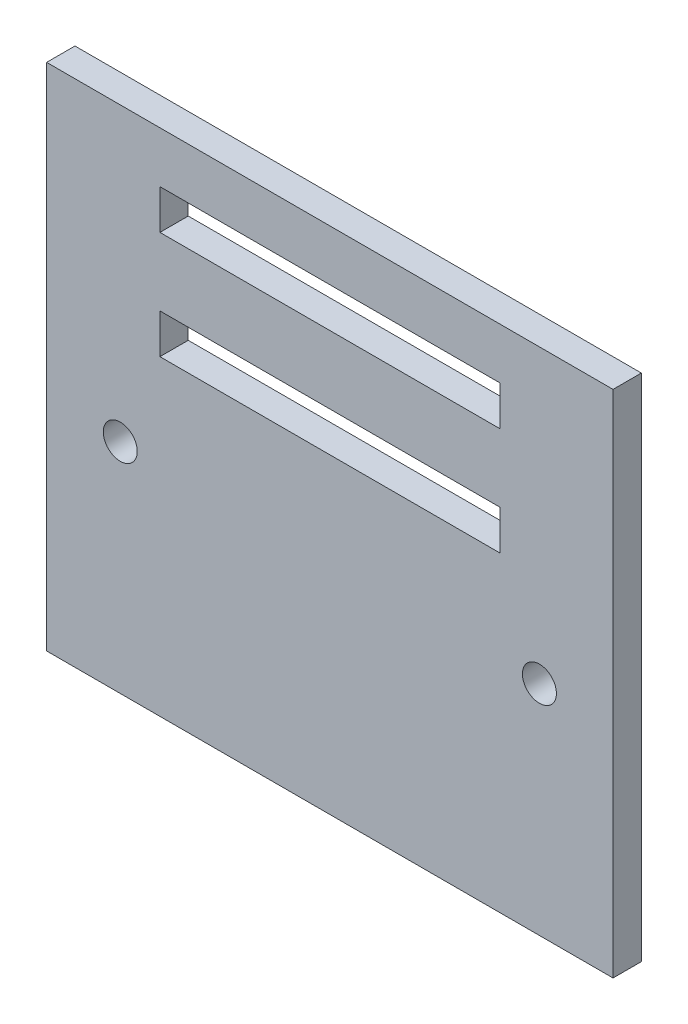
ISO-10303-21;
HEADER;
FILE_DESCRIPTION(('STEP AP214'),'2;1');
FILE_NAME('part.step','',(''),(''),'','','');
FILE_SCHEMA(('AUTOMOTIVE_DESIGN { 1 0 10303 214 1 1 1 1 }'));
ENDSEC;
DATA;
#1=APPLICATION_CONTEXT('core data for automotive mechanical design processes');
#2=APPLICATION_PROTOCOL_DEFINITION('international standard','automotive_design',2000,#1);
#3=PRODUCT_CONTEXT('',#1,'mechanical');
#4=PRODUCT('Part','Part','',(#3));
#5=PRODUCT_RELATED_PRODUCT_CATEGORY('part','',(#4));
#6=PRODUCT_DEFINITION_FORMATION('','',#4);
#7=PRODUCT_DEFINITION_CONTEXT('part definition',#1,'design');
#8=PRODUCT_DEFINITION('design','',#6,#7);
#9=PRODUCT_DEFINITION_SHAPE('','',#8);
#10=(LENGTH_UNIT() NAMED_UNIT(*) SI_UNIT(.MILLI.,.METRE.));
#11=(NAMED_UNIT(*) PLANE_ANGLE_UNIT() SI_UNIT($,.RADIAN.));
#12=(NAMED_UNIT(*) SI_UNIT($,.STERADIAN.) SOLID_ANGLE_UNIT());
#13=UNCERTAINTY_MEASURE_WITH_UNIT(LENGTH_MEASURE(1.E-05),#10,'distance_accuracy_value','');
#14=(GEOMETRIC_REPRESENTATION_CONTEXT(3) GLOBAL_UNCERTAINTY_ASSIGNED_CONTEXT((#13)) GLOBAL_UNIT_ASSIGNED_CONTEXT((#10,
#11,#12)) REPRESENTATION_CONTEXT('',''));
#15=CARTESIAN_POINT('',(0.,0.,0.));
#16=DIRECTION('',(0.,0.,1.));
#17=DIRECTION('',(1.,0.,0.));
#18=AXIS2_PLACEMENT_3D('',#15,#16,#17);
#19=CARTESIAN_POINT('',(0.,0.,0.125));
#20=DIRECTION('',(0.,0.,-1.));
#21=DIRECTION('',(-1.,0.,0.));
#22=AXIS2_PLACEMENT_3D('',#19,#20,#21);
#23=PLANE('',#22);
#24=DIRECTION('',(0.,-1.,0.));
#25=VECTOR('',#24,1.);
#26=CARTESIAN_POINT('',(1.,3.7,0.125));
#27=LINE('',#26,#25);
#28=CARTESIAN_POINT('',(1.,4.05,0.125));
#29=VERTEX_POINT('',#28);
#30=CARTESIAN_POINT('',(1.,3.7,0.125));
#31=VERTEX_POINT('',#30);
#32=EDGE_CURVE('E161',#29,#31,#27,.T.);
#33=ORIENTED_EDGE('',*,*,#32,.F.);
#34=DIRECTION('',(-1.,0.,0.));
#35=VECTOR('',#34,1.);
#36=CARTESIAN_POINT('',(1.,4.05,0.125));
#37=LINE('',#36,#35);
#38=CARTESIAN_POINT('',(4.,4.05,0.125));
#39=VERTEX_POINT('',#38);
#40=EDGE_CURVE('E169',#39,#29,#37,.T.);
#41=ORIENTED_EDGE('',*,*,#40,.F.);
#42=DIRECTION('',(0.,1.,0.));
#43=VECTOR('',#42,1.);
#44=CARTESIAN_POINT('',(4.,3.7,0.125));
#45=LINE('',#44,#43);
#46=CARTESIAN_POINT('',(4.,3.7,0.125));
#47=VERTEX_POINT('',#46);
#48=EDGE_CURVE('E166',#47,#39,#45,.T.);
#49=ORIENTED_EDGE('',*,*,#48,.F.);
#50=DIRECTION('',(1.,0.,0.));
#51=VECTOR('',#50,1.);
#52=CARTESIAN_POINT('',(1.,3.7,0.125));
#53=LINE('',#52,#51);
#54=EDGE_CURVE('E163',#31,#47,#53,.T.);
#55=ORIENTED_EDGE('',*,*,#54,.F.);
#56=EDGE_LOOP('',(#33,#41,#49,#55));
#57=FACE_BOUND('',#56,.T.);
#58=DIRECTION('',(0.,-1.,0.));
#59=VECTOR('',#58,1.);
#60=CARTESIAN_POINT('',(0.,0.,0.125));
#61=LINE('',#60,#59);
#62=CARTESIAN_POINT('',(0.,4.5,0.125));
#63=VERTEX_POINT('',#62);
#64=CARTESIAN_POINT('',(0.,0.,0.125));
#65=VERTEX_POINT('',#64);
#66=EDGE_CURVE('E192',#63,#65,#61,.T.);
#67=ORIENTED_EDGE('',*,*,#66,.T.);
#68=DIRECTION('',(1.,0.,0.));
#69=VECTOR('',#68,1.);
#70=CARTESIAN_POINT('',(0.,0.,0.125));
#71=LINE('',#70,#69);
#72=CARTESIAN_POINT('',(5.,0.,0.125));
#73=VERTEX_POINT('',#72);
#74=EDGE_CURVE('E195',#65,#73,#71,.T.);
#75=ORIENTED_EDGE('',*,*,#74,.T.);
#76=DIRECTION('',(0.,1.,0.));
#77=VECTOR('',#76,1.);
#78=CARTESIAN_POINT('',(5.,0.,0.125));
#79=LINE('',#78,#77);
#80=CARTESIAN_POINT('',(5.,4.5,0.125));
#81=VERTEX_POINT('',#80);
#82=EDGE_CURVE('E198',#73,#81,#79,.T.);
#83=ORIENTED_EDGE('',*,*,#82,.T.);
#84=DIRECTION('',(-1.,0.,0.));
#85=VECTOR('',#84,1.);
#86=CARTESIAN_POINT('',(0.,4.5,0.125));
#87=LINE('',#86,#85);
#88=EDGE_CURVE('E200',#81,#63,#87,.T.);
#89=ORIENTED_EDGE('',*,*,#88,.T.);
#90=EDGE_LOOP('',(#67,#75,#83,#89));
#91=FACE_BOUND('',#90,.T.);
#92=DIRECTION('',(0.,-1.,0.));
#93=VECTOR('',#92,1.);
#94=CARTESIAN_POINT('',(1.,3.1,0.125));
#95=LINE('',#94,#93);
#96=CARTESIAN_POINT('',(1.,3.1,0.125));
#97=VERTEX_POINT('',#96);
#98=CARTESIAN_POINT('',(1.,2.75,0.125));
#99=VERTEX_POINT('',#98);
#100=EDGE_CURVE('E122',#97,#99,#95,.T.);
#101=ORIENTED_EDGE('',*,*,#100,.F.);
#102=DIRECTION('',(-1.,0.,0.));
#103=VECTOR('',#102,1.);
#104=CARTESIAN_POINT('',(1.,3.1,0.125));
#105=LINE('',#104,#103);
#106=CARTESIAN_POINT('',(4.,3.1,0.125));
#107=VERTEX_POINT('',#106);
#108=EDGE_CURVE('E145',#107,#97,#105,.T.);
#109=ORIENTED_EDGE('',*,*,#108,.F.);
#110=DIRECTION('',(0.,1.,0.));
#111=VECTOR('',#110,1.);
#112=CARTESIAN_POINT('',(4.,3.1,0.125));
#113=LINE('',#112,#111);
#114=CARTESIAN_POINT('',(4.,2.75,0.125));
#115=VERTEX_POINT('',#114);
#116=EDGE_CURVE('E143',#115,#107,#113,.T.);
#117=ORIENTED_EDGE('',*,*,#116,.F.);
#118=DIRECTION('',(1.,0.,0.));
#119=VECTOR('',#118,1.);
#120=CARTESIAN_POINT('',(1.,2.75,0.125));
#121=LINE('',#120,#119);
#122=EDGE_CURVE('E130',#99,#115,#121,.T.);
#123=ORIENTED_EDGE('',*,*,#122,.F.);
#124=EDGE_LOOP('',(#101,#109,#117,#123));
#125=FACE_BOUND('',#124,.T.);
#126=CARTESIAN_POINT('',(0.65,1.925,0.125));
#127=DIRECTION('',(0.,0.,1.));
#128=DIRECTION('',(1.,0.,0.));
#129=AXIS2_PLACEMENT_3D('',#126,#127,#128);
#130=CIRCLE('',#129,0.15);
#131=CARTESIAN_POINT('',(0.8,1.925,0.125));
#132=VERTEX_POINT('',#131);
#133=EDGE_CURVE('E151',#132,#132,#130,.T.);
#134=ORIENTED_EDGE('',*,*,#133,.F.);
#135=EDGE_LOOP('',(#134));
#136=FACE_BOUND('',#135,.T.);
#137=CARTESIAN_POINT('',(4.35,1.925,0.125));
#138=DIRECTION('',(0.,0.,1.));
#139=DIRECTION('',(1.,0.,0.));
#140=AXIS2_PLACEMENT_3D('',#137,#138,#139);
#141=CIRCLE('',#140,0.15);
#142=CARTESIAN_POINT('',(4.5,1.925,0.125));
#143=VERTEX_POINT('',#142);
#144=EDGE_CURVE('E308',#143,#143,#141,.T.);
#145=ORIENTED_EDGE('',*,*,#144,.F.);
#146=EDGE_LOOP('',(#145));
#147=FACE_BOUND('',#146,.T.);
#148=ADVANCED_FACE('F33',(#57,#91,#125,#136,#147),#23,.F.);
#149=CARTESIAN_POINT('',(0.,0.,-0.125));
#150=DIRECTION('',(0.,0.,-1.));
#151=DIRECTION('',(-1.,0.,0.));
#152=AXIS2_PLACEMENT_3D('',#149,#150,#151);
#153=PLANE('',#152);
#154=CARTESIAN_POINT('',(0.65,1.925,-0.125));
#155=DIRECTION('',(0.,0.,1.));
#156=DIRECTION('',(1.,0.,0.));
#157=AXIS2_PLACEMENT_3D('',#154,#155,#156);
#158=CIRCLE('',#157,0.15);
#159=CARTESIAN_POINT('',(0.8,1.925,-0.125));
#160=VERTEX_POINT('',#159);
#161=EDGE_CURVE('E314',#160,#160,#158,.T.);
#162=ORIENTED_EDGE('',*,*,#161,.T.);
#163=EDGE_LOOP('',(#162));
#164=FACE_BOUND('',#163,.T.);
#165=DIRECTION('',(0.,-1.,0.));
#166=VECTOR('',#165,1.);
#167=CARTESIAN_POINT('',(0.,0.,-0.125));
#168=LINE('',#167,#166);
#169=CARTESIAN_POINT('',(0.,4.5,-0.125));
#170=VERTEX_POINT('',#169);
#171=CARTESIAN_POINT('',(0.,0.,-0.125));
#172=VERTEX_POINT('',#171);
#173=EDGE_CURVE('E191',#170,#172,#168,.T.);
#174=ORIENTED_EDGE('',*,*,#173,.F.);
#175=DIRECTION('',(-1.,0.,0.));
#176=VECTOR('',#175,1.);
#177=CARTESIAN_POINT('',(0.,4.5,-0.125));
#178=LINE('',#177,#176);
#179=CARTESIAN_POINT('',(5.,4.5,-0.125));
#180=VERTEX_POINT('',#179);
#181=EDGE_CURVE('E196',#180,#170,#178,.T.);
#182=ORIENTED_EDGE('',*,*,#181,.F.);
#183=DIRECTION('',(0.,1.,0.));
#184=VECTOR('',#183,1.);
#185=CARTESIAN_POINT('',(5.,0.,-0.125));
#186=LINE('',#185,#184);
#187=CARTESIAN_POINT('',(5.,0.,-0.125));
#188=VERTEX_POINT('',#187);
#189=EDGE_CURVE('E207',#188,#180,#186,.T.);
#190=ORIENTED_EDGE('',*,*,#189,.F.);
#191=DIRECTION('',(1.,0.,0.));
#192=VECTOR('',#191,1.);
#193=CARTESIAN_POINT('',(0.,0.,-0.125));
#194=LINE('',#193,#192);
#195=EDGE_CURVE('E205',#172,#188,#194,.T.);
#196=ORIENTED_EDGE('',*,*,#195,.F.);
#197=EDGE_LOOP('',(#174,#182,#190,#196));
#198=FACE_BOUND('',#197,.T.);
#199=DIRECTION('',(-1.,0.,0.));
#200=VECTOR('',#199,1.);
#201=CARTESIAN_POINT('',(1.,4.05,-0.125));
#202=LINE('',#201,#200);
#203=CARTESIAN_POINT('',(4.,4.05,-0.125));
#204=VERTEX_POINT('',#203);
#205=CARTESIAN_POINT('',(1.,4.05,-0.125));
#206=VERTEX_POINT('',#205);
#207=EDGE_CURVE('E164',#204,#206,#202,.T.);
#208=ORIENTED_EDGE('',*,*,#207,.T.);
#209=DIRECTION('',(0.,-1.,0.));
#210=VECTOR('',#209,1.);
#211=CARTESIAN_POINT('',(1.,3.7,-0.125));
#212=LINE('',#211,#210);
#213=CARTESIAN_POINT('',(1.,3.7,-0.125));
#214=VERTEX_POINT('',#213);
#215=EDGE_CURVE('E138',#206,#214,#212,.T.);
#216=ORIENTED_EDGE('',*,*,#215,.T.);
#217=DIRECTION('',(1.,0.,0.));
#218=VECTOR('',#217,1.);
#219=CARTESIAN_POINT('',(1.,3.7,-0.125));
#220=LINE('',#219,#218);
#221=CARTESIAN_POINT('',(4.,3.7,-0.125));
#222=VERTEX_POINT('',#221);
#223=EDGE_CURVE('E174',#214,#222,#220,.T.);
#224=ORIENTED_EDGE('',*,*,#223,.T.);
#225=DIRECTION('',(0.,1.,0.));
#226=VECTOR('',#225,1.);
#227=CARTESIAN_POINT('',(4.,3.7,-0.125));
#228=LINE('',#227,#226);
#229=EDGE_CURVE('E177',#222,#204,#228,.T.);
#230=ORIENTED_EDGE('',*,*,#229,.T.);
#231=EDGE_LOOP('',(#208,#216,#224,#230));
#232=FACE_BOUND('',#231,.T.);
#233=DIRECTION('',(-1.,0.,0.));
#234=VECTOR('',#233,1.);
#235=CARTESIAN_POINT('',(1.,3.1,-0.125));
#236=LINE('',#235,#234);
#237=CARTESIAN_POINT('',(4.,3.1,-0.125));
#238=VERTEX_POINT('',#237);
#239=CARTESIAN_POINT('',(1.,3.1,-0.125));
#240=VERTEX_POINT('',#239);
#241=EDGE_CURVE('E131',#238,#240,#236,.T.);
#242=ORIENTED_EDGE('',*,*,#241,.T.);
#243=DIRECTION('',(0.,-1.,0.));
#244=VECTOR('',#243,1.);
#245=CARTESIAN_POINT('',(1.,3.1,-0.125));
#246=LINE('',#245,#244);
#247=CARTESIAN_POINT('',(1.,2.75,-0.125));
#248=VERTEX_POINT('',#247);
#249=EDGE_CURVE('E56',#240,#248,#246,.T.);
#250=ORIENTED_EDGE('',*,*,#249,.T.);
#251=DIRECTION('',(1.,0.,0.));
#252=VECTOR('',#251,1.);
#253=CARTESIAN_POINT('',(1.,2.75,-0.125));
#254=LINE('',#253,#252);
#255=CARTESIAN_POINT('',(4.,2.75,-0.125));
#256=VERTEX_POINT('',#255);
#257=EDGE_CURVE('E137',#248,#256,#254,.T.);
#258=ORIENTED_EDGE('',*,*,#257,.T.);
#259=DIRECTION('',(0.,1.,0.));
#260=VECTOR('',#259,1.);
#261=CARTESIAN_POINT('',(4.,3.1,-0.125));
#262=LINE('',#261,#260);
#263=EDGE_CURVE('E153',#256,#238,#262,.T.);
#264=ORIENTED_EDGE('',*,*,#263,.T.);
#265=EDGE_LOOP('',(#242,#250,#258,#264));
#266=FACE_BOUND('',#265,.T.);
#267=CARTESIAN_POINT('',(4.35,1.925,-0.125));
#268=DIRECTION('',(0.,0.,1.));
#269=DIRECTION('',(1.,0.,0.));
#270=AXIS2_PLACEMENT_3D('',#267,#268,#269);
#271=CIRCLE('',#270,0.15);
#272=CARTESIAN_POINT('',(4.5,1.925,-0.125));
#273=VERTEX_POINT('',#272);
#274=EDGE_CURVE('E311',#273,#273,#271,.T.);
#275=ORIENTED_EDGE('',*,*,#274,.T.);
#276=EDGE_LOOP('',(#275));
#277=FACE_BOUND('',#276,.T.);
#278=ADVANCED_FACE('F225',(#164,#198,#232,#266,#277),#153,.T.);
#279=CARTESIAN_POINT('',(0.,0.,0.125));
#280=DIRECTION('',(1.,0.,0.));
#281=DIRECTION('',(0.,0.,-1.));
#282=AXIS2_PLACEMENT_3D('',#279,#280,#281);
#283=PLANE('',#282);
#284=ORIENTED_EDGE('',*,*,#173,.T.);
#285=DIRECTION('',(0.,0.,-1.));
#286=VECTOR('',#285,1.);
#287=CARTESIAN_POINT('',(0.,0.,0.125));
#288=LINE('',#287,#286);
#289=EDGE_CURVE('E11',#65,#172,#288,.T.);
#290=ORIENTED_EDGE('',*,*,#289,.F.);
#291=ORIENTED_EDGE('',*,*,#66,.F.);
#292=DIRECTION('',(0.,0.,-1.));
#293=VECTOR('',#292,1.);
#294=CARTESIAN_POINT('',(0.,4.5,0.125));
#295=LINE('',#294,#293);
#296=EDGE_CURVE('E202',#63,#170,#295,.T.);
#297=ORIENTED_EDGE('',*,*,#296,.T.);
#298=EDGE_LOOP('',(#284,#290,#291,#297));
#299=FACE_BOUND('',#298,.T.);
#300=ADVANCED_FACE('F35',(#299),#283,.F.);
#301=CARTESIAN_POINT('',(0.,0.,0.125));
#302=DIRECTION('',(0.,1.,0.));
#303=DIRECTION('',(0.,0.,1.));
#304=AXIS2_PLACEMENT_3D('',#301,#302,#303);
#305=PLANE('',#304);
#306=ORIENTED_EDGE('',*,*,#195,.T.);
#307=DIRECTION('',(0.,0.,-1.));
#308=VECTOR('',#307,1.);
#309=CARTESIAN_POINT('',(5.,0.,0.125));
#310=LINE('',#309,#308);
#311=EDGE_CURVE('E41',#73,#188,#310,.T.);
#312=ORIENTED_EDGE('',*,*,#311,.F.);
#313=ORIENTED_EDGE('',*,*,#74,.F.);
#314=ORIENTED_EDGE('',*,*,#289,.T.);
#315=EDGE_LOOP('',(#306,#312,#313,#314));
#316=FACE_BOUND('',#315,.T.);
#317=ADVANCED_FACE('F235',(#316),#305,.F.);
#318=CARTESIAN_POINT('',(5.,0.,0.125));
#319=DIRECTION('',(-1.,0.,0.));
#320=DIRECTION('',(0.,0.,1.));
#321=AXIS2_PLACEMENT_3D('',#318,#319,#320);
#322=PLANE('',#321);
#323=ORIENTED_EDGE('',*,*,#189,.T.);
#324=DIRECTION('',(0.,0.,-1.));
#325=VECTOR('',#324,1.);
#326=CARTESIAN_POINT('',(5.,4.5,0.125));
#327=LINE('',#326,#325);
#328=EDGE_CURVE('E212',#81,#180,#327,.T.);
#329=ORIENTED_EDGE('',*,*,#328,.F.);
#330=ORIENTED_EDGE('',*,*,#82,.F.);
#331=ORIENTED_EDGE('',*,*,#311,.T.);
#332=EDGE_LOOP('',(#323,#329,#330,#331));
#333=FACE_BOUND('',#332,.T.);
#334=ADVANCED_FACE('F219',(#333),#322,.F.);
#335=CARTESIAN_POINT('',(0.,4.5,0.125));
#336=DIRECTION('',(0.,-1.,0.));
#337=DIRECTION('',(0.,0.,-1.));
#338=AXIS2_PLACEMENT_3D('',#335,#336,#337);
#339=PLANE('',#338);
#340=ORIENTED_EDGE('',*,*,#181,.T.);
#341=ORIENTED_EDGE('',*,*,#296,.F.);
#342=ORIENTED_EDGE('',*,*,#88,.F.);
#343=ORIENTED_EDGE('',*,*,#328,.T.);
#344=EDGE_LOOP('',(#340,#341,#342,#343));
#345=FACE_BOUND('',#344,.T.);
#346=ADVANCED_FACE('F229',(#345),#339,.F.);
#347=CARTESIAN_POINT('',(1.,3.7,0.125));
#348=DIRECTION('',(1.,0.,0.));
#349=DIRECTION('',(0.,1.,0.));
#350=AXIS2_PLACEMENT_3D('',#347,#348,#349);
#351=PLANE('',#350);
#352=ORIENTED_EDGE('',*,*,#215,.F.);
#353=DIRECTION('',(0.,0.,-1.));
#354=VECTOR('',#353,1.);
#355=CARTESIAN_POINT('',(1.,4.05,0.125));
#356=LINE('',#355,#354);
#357=EDGE_CURVE('E171',#29,#206,#356,.T.);
#358=ORIENTED_EDGE('',*,*,#357,.F.);
#359=ORIENTED_EDGE('',*,*,#32,.T.);
#360=DIRECTION('',(0.,0.,-1.));
#361=VECTOR('',#360,1.);
#362=CARTESIAN_POINT('',(1.,3.7,0.125));
#363=LINE('',#362,#361);
#364=EDGE_CURVE('E188',#31,#214,#363,.T.);
#365=ORIENTED_EDGE('',*,*,#364,.T.);
#366=EDGE_LOOP('',(#352,#358,#359,#365));
#367=FACE_BOUND('',#366,.T.);
#368=ADVANCED_FACE('F252',(#367),#351,.T.);
#369=CARTESIAN_POINT('',(1.,3.7,0.125));
#370=DIRECTION('',(0.,1.,0.));
#371=DIRECTION('',(0.,0.,1.));
#372=AXIS2_PLACEMENT_3D('',#369,#370,#371);
#373=PLANE('',#372);
#374=ORIENTED_EDGE('',*,*,#223,.F.);
#375=ORIENTED_EDGE('',*,*,#364,.F.);
#376=ORIENTED_EDGE('',*,*,#54,.T.);
#377=DIRECTION('',(0.,0.,-1.));
#378=VECTOR('',#377,1.);
#379=CARTESIAN_POINT('',(4.,3.7,0.125));
#380=LINE('',#379,#378);
#381=EDGE_CURVE('E186',#47,#222,#380,.T.);
#382=ORIENTED_EDGE('',*,*,#381,.T.);
#383=EDGE_LOOP('',(#374,#375,#376,#382));
#384=FACE_BOUND('',#383,.T.);
#385=ADVANCED_FACE('F259',(#384),#373,.T.);
#386=CARTESIAN_POINT('',(4.,3.7,0.125));
#387=DIRECTION('',(-1.,0.,0.));
#388=DIRECTION('',(0.,0.,1.));
#389=AXIS2_PLACEMENT_3D('',#386,#387,#388);
#390=PLANE('',#389);
#391=ORIENTED_EDGE('',*,*,#229,.F.);
#392=ORIENTED_EDGE('',*,*,#381,.F.);
#393=ORIENTED_EDGE('',*,*,#48,.T.);
#394=DIRECTION('',(0.,0.,-1.));
#395=VECTOR('',#394,1.);
#396=CARTESIAN_POINT('',(4.,4.05,0.125));
#397=LINE('',#396,#395);
#398=EDGE_CURVE('E184',#39,#204,#397,.T.);
#399=ORIENTED_EDGE('',*,*,#398,.T.);
#400=EDGE_LOOP('',(#391,#392,#393,#399));
#401=FACE_BOUND('',#400,.T.);
#402=ADVANCED_FACE('F264',(#401),#390,.T.);
#403=CARTESIAN_POINT('',(1.,4.05,0.125));
#404=DIRECTION('',(0.,-1.,0.));
#405=DIRECTION('',(0.,0.,-1.));
#406=AXIS2_PLACEMENT_3D('',#403,#404,#405);
#407=PLANE('',#406);
#408=ORIENTED_EDGE('',*,*,#207,.F.);
#409=ORIENTED_EDGE('',*,*,#398,.F.);
#410=ORIENTED_EDGE('',*,*,#40,.T.);
#411=ORIENTED_EDGE('',*,*,#357,.T.);
#412=EDGE_LOOP('',(#408,#409,#410,#411));
#413=FACE_BOUND('',#412,.T.);
#414=ADVANCED_FACE('F270',(#413),#407,.T.);
#415=CARTESIAN_POINT('',(1.,3.1,0.125));
#416=DIRECTION('',(1.,0.,0.));
#417=DIRECTION('',(0.,0.,-1.));
#418=AXIS2_PLACEMENT_3D('',#415,#416,#417);
#419=PLANE('',#418);
#420=ORIENTED_EDGE('',*,*,#249,.F.);
#421=DIRECTION('',(0.,0.,-1.));
#422=VECTOR('',#421,1.);
#423=CARTESIAN_POINT('',(1.,3.1,0.125));
#424=LINE('',#423,#422);
#425=EDGE_CURVE('E126',#97,#240,#424,.T.);
#426=ORIENTED_EDGE('',*,*,#425,.F.);
#427=ORIENTED_EDGE('',*,*,#100,.T.);
#428=DIRECTION('',(0.,0.,-1.));
#429=VECTOR('',#428,1.);
#430=CARTESIAN_POINT('',(1.,2.75,0.125));
#431=LINE('',#430,#429);
#432=EDGE_CURVE('E125',#99,#248,#431,.T.);
#433=ORIENTED_EDGE('',*,*,#432,.T.);
#434=EDGE_LOOP('',(#420,#426,#427,#433));
#435=FACE_BOUND('',#434,.T.);
#436=ADVANCED_FACE('F124',(#435),#419,.T.);
#437=CARTESIAN_POINT('',(1.,2.75,0.125));
#438=DIRECTION('',(0.,1.,0.));
#439=DIRECTION('',(0.,0.,1.));
#440=AXIS2_PLACEMENT_3D('',#437,#438,#439);
#441=PLANE('',#440);
#442=ORIENTED_EDGE('',*,*,#257,.F.);
#443=ORIENTED_EDGE('',*,*,#432,.F.);
#444=ORIENTED_EDGE('',*,*,#122,.T.);
#445=DIRECTION('',(0.,0.,-1.));
#446=VECTOR('',#445,1.);
#447=CARTESIAN_POINT('',(4.,2.75,0.125));
#448=LINE('',#447,#446);
#449=EDGE_CURVE('E139',#115,#256,#448,.T.);
#450=ORIENTED_EDGE('',*,*,#449,.T.);
#451=EDGE_LOOP('',(#442,#443,#444,#450));
#452=FACE_BOUND('',#451,.T.);
#453=ADVANCED_FACE('F134',(#452),#441,.T.);
#454=CARTESIAN_POINT('',(4.,3.1,0.125));
#455=DIRECTION('',(-1.,0.,0.));
#456=DIRECTION('',(0.,0.,1.));
#457=AXIS2_PLACEMENT_3D('',#454,#455,#456);
#458=PLANE('',#457);
#459=ORIENTED_EDGE('',*,*,#263,.F.);
#460=ORIENTED_EDGE('',*,*,#449,.F.);
#461=ORIENTED_EDGE('',*,*,#116,.T.);
#462=DIRECTION('',(0.,0.,-1.));
#463=VECTOR('',#462,1.);
#464=CARTESIAN_POINT('',(4.,3.1,0.125));
#465=LINE('',#464,#463);
#466=EDGE_CURVE('E48',#107,#238,#465,.T.);
#467=ORIENTED_EDGE('',*,*,#466,.T.);
#468=EDGE_LOOP('',(#459,#460,#461,#467));
#469=FACE_BOUND('',#468,.T.);
#470=ADVANCED_FACE('F289',(#469),#458,.T.);
#471=CARTESIAN_POINT('',(1.,3.1,0.125));
#472=DIRECTION('',(0.,-1.,0.));
#473=DIRECTION('',(0.,0.,-1.));
#474=AXIS2_PLACEMENT_3D('',#471,#472,#473);
#475=PLANE('',#474);
#476=ORIENTED_EDGE('',*,*,#241,.F.);
#477=ORIENTED_EDGE('',*,*,#466,.F.);
#478=ORIENTED_EDGE('',*,*,#108,.T.);
#479=ORIENTED_EDGE('',*,*,#425,.T.);
#480=EDGE_LOOP('',(#476,#477,#478,#479));
#481=FACE_BOUND('',#480,.T.);
#482=ADVANCED_FACE('F292',(#481),#475,.T.);
#483=CARTESIAN_POINT('',(0.65,1.925,0.125));
#484=DIRECTION('',(0.,0.,-1.));
#485=DIRECTION('',(-1.,0.,0.));
#486=AXIS2_PLACEMENT_3D('',#483,#484,#485);
#487=CYLINDRICAL_SURFACE('',#486,0.15);
#488=ORIENTED_EDGE('',*,*,#133,.T.);
#489=EDGE_LOOP('',(#488));
#490=FACE_BOUND('',#489,.T.);
#491=ORIENTED_EDGE('',*,*,#161,.F.);
#492=EDGE_LOOP('',(#491));
#493=FACE_BOUND('',#492,.T.);
#494=ADVANCED_FACE('F296',(#490,#493),#487,.F.);
#495=CARTESIAN_POINT('',(4.35,1.925,0.125));
#496=DIRECTION('',(0.,0.,-1.));
#497=DIRECTION('',(-1.,0.,0.));
#498=AXIS2_PLACEMENT_3D('',#495,#496,#497);
#499=CYLINDRICAL_SURFACE('',#498,0.15);
#500=ORIENTED_EDGE('',*,*,#144,.T.);
#501=EDGE_LOOP('',(#500));
#502=FACE_BOUND('',#501,.T.);
#503=ORIENTED_EDGE('',*,*,#274,.F.);
#504=EDGE_LOOP('',(#503));
#505=FACE_BOUND('',#504,.T.);
#506=ADVANCED_FACE('F299',(#502,#505),#499,.F.);
#507=CLOSED_SHELL('',(#148,#278,#300,#317,#334,#346,#368,#385,#402,#414,#436,#453,#470,#482,
#494,#506));
#508=MANIFOLD_SOLID_BREP('B2',#507);
#509=ADVANCED_BREP_SHAPE_REPRESENTATION('',(#18,#508),#14);
#510=SHAPE_DEFINITION_REPRESENTATION(#9,#509);
ENDSEC;
END-ISO-10303-21;
